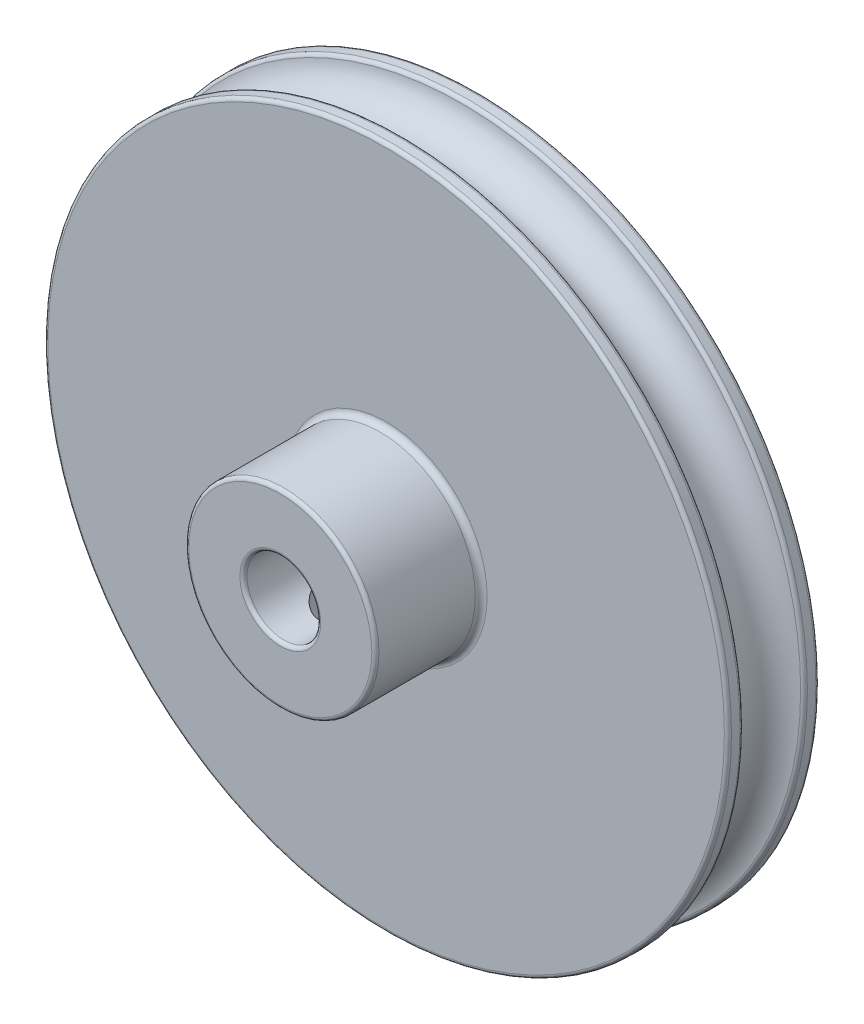
ISO-10303-21;
HEADER;
FILE_DESCRIPTION(('STEP AP214'),'2;1');
FILE_NAME('part.step','',(''),(''),'','','');
FILE_SCHEMA(('AUTOMOTIVE_DESIGN { 1 0 10303 214 1 1 1 1 }'));
ENDSEC;
DATA;
#1=APPLICATION_CONTEXT('core data for automotive mechanical design processes');
#2=APPLICATION_PROTOCOL_DEFINITION('international standard','automotive_design',2000,#1);
#3=PRODUCT_CONTEXT('',#1,'mechanical');
#4=PRODUCT('Part','Part','',(#3));
#5=PRODUCT_RELATED_PRODUCT_CATEGORY('part','',(#4));
#6=PRODUCT_DEFINITION_FORMATION('','',#4);
#7=PRODUCT_DEFINITION_CONTEXT('part definition',#1,'design');
#8=PRODUCT_DEFINITION('design','',#6,#7);
#9=PRODUCT_DEFINITION_SHAPE('','',#8);
#10=(LENGTH_UNIT() NAMED_UNIT(*) SI_UNIT(.MILLI.,.METRE.));
#11=(NAMED_UNIT(*) PLANE_ANGLE_UNIT() SI_UNIT($,.RADIAN.));
#12=(NAMED_UNIT(*) SI_UNIT($,.STERADIAN.) SOLID_ANGLE_UNIT());
#13=UNCERTAINTY_MEASURE_WITH_UNIT(LENGTH_MEASURE(1.E-05),#10,'distance_accuracy_value','');
#14=(GEOMETRIC_REPRESENTATION_CONTEXT(3) GLOBAL_UNCERTAINTY_ASSIGNED_CONTEXT((#13)) GLOBAL_UNIT_ASSIGNED_CONTEXT((#10,
#11,#12)) REPRESENTATION_CONTEXT('',''));
#15=CARTESIAN_POINT('',(0.,0.,0.));
#16=DIRECTION('',(0.,0.,1.));
#17=DIRECTION('',(1.,0.,0.));
#18=AXIS2_PLACEMENT_3D('',#15,#16,#17);
#19=CARTESIAN_POINT('',(0.,0.,3.85));
#20=DIRECTION('',(0.,0.,-1.));
#21=DIRECTION('',(-1.,0.,0.));
#22=AXIS2_PLACEMENT_3D('',#19,#20,#21);
#23=CYLINDRICAL_SURFACE('',#22,28.75);
#24=CARTESIAN_POINT('',(0.,0.,3.55));
#25=DIRECTION('',(0.,0.,1.));
#26=DIRECTION('',(1.,0.,0.));
#27=AXIS2_PLACEMENT_3D('',#24,#25,#26);
#28=CIRCLE('',#27,28.75);
#29=CARTESIAN_POINT('',(28.75,0.,3.55));
#30=VERTEX_POINT('',#29);
#31=EDGE_CURVE('E105',#30,#30,#28,.F.);
#32=ORIENTED_EDGE('',*,*,#31,.T.);
#33=EDGE_LOOP('',(#32));
#34=FACE_BOUND('',#33,.T.);
#35=CARTESIAN_POINT('',(0.,0.,2.83416654415368));
#36=DIRECTION('',(0.,0.,-1.));
#37=DIRECTION('',(-1.,0.,0.));
#38=AXIS2_PLACEMENT_3D('',#35,#36,#37);
#39=CIRCLE('',#38,28.75);
#40=CARTESIAN_POINT('',(28.75,0.,2.83416654415368));
#41=VERTEX_POINT('',#40);
#42=EDGE_CURVE('E79',#41,#41,#39,.F.);
#43=ORIENTED_EDGE('',*,*,#42,.T.);
#44=EDGE_LOOP('',(#43));
#45=FACE_BOUND('',#44,.T.);
#46=ADVANCED_FACE('F49',(#34,#45),#23,.T.);
#47=CARTESIAN_POINT('',(0.,0.,3.85));
#48=DIRECTION('',(0.,0.,1.));
#49=DIRECTION('',(1.,0.,0.));
#50=AXIS2_PLACEMENT_3D('',#47,#48,#49);
#51=PLANE('',#50);
#52=CARTESIAN_POINT('',(0.,0.,3.85));
#53=DIRECTION('',(0.,0.,1.));
#54=DIRECTION('',(1.,0.,0.));
#55=AXIS2_PLACEMENT_3D('',#52,#53,#54);
#56=CIRCLE('',#55,28.45);
#57=CARTESIAN_POINT('',(28.45,0.,3.85));
#58=VERTEX_POINT('',#57);
#59=EDGE_CURVE('E111',#58,#58,#56,.T.);
#60=ORIENTED_EDGE('',*,*,#59,.T.);
#61=EDGE_LOOP('',(#60));
#62=FACE_BOUND('',#61,.T.);
#63=CARTESIAN_POINT('',(0.,0.,3.85));
#64=DIRECTION('',(0.,0.,1.));
#65=DIRECTION('',(1.,0.,0.));
#66=AXIS2_PLACEMENT_3D('',#63,#64,#65);
#67=CIRCLE('',#66,8.5);
#68=CARTESIAN_POINT('',(8.5,0.,3.85));
#69=VERTEX_POINT('',#68);
#70=EDGE_CURVE('E131',#69,#69,#67,.F.);
#71=ORIENTED_EDGE('',*,*,#70,.T.);
#72=EDGE_LOOP('',(#71));
#73=FACE_BOUND('',#72,.T.);
#74=ADVANCED_FACE('F176',(#62,#73),#51,.T.);
#75=CARTESIAN_POINT('',(0.,0.,0.));
#76=DIRECTION('',(0.,0.,1.));
#77=DIRECTION('',(1.,0.,0.));
#78=AXIS2_PLACEMENT_3D('',#75,#76,#77);
#79=TOROIDAL_SURFACE('',#78,28.75,2.55);
#80=CARTESIAN_POINT('',(28.75,0.,0.));
#81=DIRECTION('',(0.,1.,0.));
#82=DIRECTION('',(0.,0.,1.));
#83=AXIS2_PLACEMENT_3D('',#80,#81,#82);
#84=CIRCLE('',#83,2.55);
#85=CARTESIAN_POINT('',(28.4815789473681,0.,-2.53583322371638));
#86=VERTEX_POINT('',#85);
#87=CARTESIAN_POINT('',(28.4815789473681,0.,2.53583322371638));
#88=VERTEX_POINT('',#87);
#89=EDGE_CURVE('E138',#86,#88,#84,.T.);
#90=ORIENTED_EDGE('',*,*,#89,.T.);
#91=CARTESIAN_POINT('',(0.,0.,2.53583322371638));
#92=DIRECTION('',(0.,0.,-1.));
#93=DIRECTION('',(-1.,0.,0.));
#94=AXIS2_PLACEMENT_3D('',#91,#92,#93);
#95=CIRCLE('',#94,28.4815789473684);
#96=EDGE_CURVE('E81',#88,#88,#95,.T.);
#97=ORIENTED_EDGE('',*,*,#96,.T.);
#98=ORIENTED_EDGE('',*,*,#89,.F.);
#99=CARTESIAN_POINT('',(0.,0.,-2.53583322371638));
#100=DIRECTION('',(0.,0.,1.));
#101=DIRECTION('',(1.,0.,0.));
#102=AXIS2_PLACEMENT_3D('',#99,#100,#101);
#103=CIRCLE('',#102,28.4815789473684);
#104=EDGE_CURVE('E101',#86,#86,#103,.T.);
#105=ORIENTED_EDGE('',*,*,#104,.T.);
#106=EDGE_LOOP('',(#90,#97,#98,#105));
#107=FACE_BOUND('',#106,.T.);
#108=ADVANCED_FACE('F172',(#107),#79,.F.);
#109=CARTESIAN_POINT('',(0.,0.,-3.85));
#110=DIRECTION('',(0.,0.,1.));
#111=DIRECTION('',(1.,0.,0.));
#112=AXIS2_PLACEMENT_3D('',#109,#110,#111);
#113=PLANE('',#112);
#114=CARTESIAN_POINT('',(0.,0.,-3.85));
#115=DIRECTION('',(0.,0.,1.));
#116=DIRECTION('',(1.,0.,0.));
#117=AXIS2_PLACEMENT_3D('',#114,#115,#116);
#118=CIRCLE('',#117,28.45);
#119=CARTESIAN_POINT('',(28.45,0.,-3.85));
#120=VERTEX_POINT('',#119);
#121=EDGE_CURVE('E12',#120,#120,#118,.F.);
#122=ORIENTED_EDGE('',*,*,#121,.T.);
#123=EDGE_LOOP('',(#122));
#124=FACE_BOUND('',#123,.T.);
#125=ADVANCED_FACE('F175',(#124),#113,.F.);
#126=CARTESIAN_POINT('',(0.,0.,-2.83416654415368));
#127=DIRECTION('',(0.,0.,1.));
#128=DIRECTION('',(1.,0.,0.));
#129=AXIS2_PLACEMENT_3D('',#126,#127,#128);
#130=CIRCLE('',#129,28.75);
#131=CARTESIAN_POINT('',(28.75,0.,-2.83416654415368));
#132=VERTEX_POINT('',#131);
#133=EDGE_CURVE('E59',#132,#132,#130,.F.);
#134=ORIENTED_EDGE('',*,*,#133,.T.);
#135=EDGE_LOOP('',(#134));
#136=FACE_BOUND('',#135,.T.);
#137=CARTESIAN_POINT('',(0.,0.,-3.55));
#138=DIRECTION('',(0.,0.,1.));
#139=DIRECTION('',(1.,0.,0.));
#140=AXIS2_PLACEMENT_3D('',#137,#138,#139);
#141=CIRCLE('',#140,28.75);
#142=CARTESIAN_POINT('',(28.75,0.,-3.55));
#143=VERTEX_POINT('',#142);
#144=EDGE_CURVE('E95',#143,#143,#141,.T.);
#145=ORIENTED_EDGE('',*,*,#144,.T.);
#146=EDGE_LOOP('',(#145));
#147=FACE_BOUND('',#146,.T.);
#148=ADVANCED_FACE('F170',(#136,#147),#23,.T.);
#149=CARTESIAN_POINT('',(0.,0.,12.75));
#150=DIRECTION('',(0.,0.,-1.));
#151=DIRECTION('',(-1.,0.,0.));
#152=AXIS2_PLACEMENT_3D('',#149,#150,#151);
#153=CYLINDRICAL_SURFACE('',#152,8.);
#154=CARTESIAN_POINT('',(0.,0.,12.45));
#155=DIRECTION('',(0.,0.,1.));
#156=DIRECTION('',(1.,0.,0.));
#157=AXIS2_PLACEMENT_3D('',#154,#155,#156);
#158=CIRCLE('',#157,8.);
#159=CARTESIAN_POINT('',(8.,0.,12.45));
#160=VERTEX_POINT('',#159);
#161=EDGE_CURVE('E115',#160,#160,#158,.F.);
#162=ORIENTED_EDGE('',*,*,#161,.T.);
#163=EDGE_LOOP('',(#162));
#164=FACE_BOUND('',#163,.T.);
#165=CARTESIAN_POINT('',(0.,0.,4.35));
#166=DIRECTION('',(0.,0.,1.));
#167=DIRECTION('',(1.,0.,0.));
#168=AXIS2_PLACEMENT_3D('',#165,#166,#167);
#169=CIRCLE('',#168,8.);
#170=CARTESIAN_POINT('',(8.,0.,4.35));
#171=VERTEX_POINT('',#170);
#172=EDGE_CURVE('E135',#171,#171,#169,.T.);
#173=ORIENTED_EDGE('',*,*,#172,.T.);
#174=EDGE_LOOP('',(#173));
#175=FACE_BOUND('',#174,.T.);
#176=CARTESIAN_POINT('',(0.,-8.,9.5));
#177=CARTESIAN_POINT('',(0.110501451559641,-7.9999981315735,9.49999689901579));
#178=CARTESIAN_POINT('',(0.221037543774351,-7.99768770842435,9.49081126563495));
#179=CARTESIAN_POINT('',(0.438941765027377,-7.98869485106526,9.45436646492399));
#180=CARTESIAN_POINT('',(0.546308062494319,-7.98200993893301,9.42709705394953));
#181=CARTESIAN_POINT('',(0.754694496243435,-7.96500835109376,9.35541432871722));
#182=CARTESIAN_POINT('',(0.855722084573336,-7.95469603789411,9.31102160171297));
#183=CARTESIAN_POINT('',(1.04889617587257,-7.93153791743495,9.20642481327354));
#184=CARTESIAN_POINT('',(1.14104237913168,-7.91869202472209,9.14622021850805));
#185=CARTESIAN_POINT('',(1.31573590306789,-7.89156551455591,9.01039894712776));
#186=CARTESIAN_POINT('',(1.39807425341474,-7.87726276197502,8.93451790005459));
#187=CARTESIAN_POINT('',(1.54899856960443,-7.84898160157248,8.77006372678795));
#188=CARTESIAN_POINT('',(1.61758298259892,-7.83500323053157,8.68148916940408));
#189=CARTESIAN_POINT('',(1.74003539039863,-7.80873034264225,8.49253969768401));
#190=CARTESIAN_POINT('',(1.79366962123352,-7.79646392619748,8.39200902558836));
#191=CARTESIAN_POINT('',(1.88319587806766,-7.77532659757355,8.18300211778662));
#192=CARTESIAN_POINT('',(1.91909074058685,-7.76645514259225,8.07452715555731));
#193=CARTESIAN_POINT('',(1.97140644907302,-7.7533396892843,7.85500866906446));
#194=CARTESIAN_POINT('',(1.98820302444274,-7.74900654662681,7.74406013861601));
#195=CARTESIAN_POINT('',(2.00301570008854,-7.74519149946122,7.52084190800087));
#196=CARTESIAN_POINT('',(2.00103485575748,-7.74570880570571,7.40857242574382));
#197=CARTESIAN_POINT('',(1.97864869951961,-7.75145607355756,7.1887789230062));
#198=CARTESIAN_POINT('',(1.95869112025418,-7.75657150676391,7.08120583804623));
#199=CARTESIAN_POINT('',(1.90163224920399,-7.77075612894758,6.87098526545192));
#200=CARTESIAN_POINT('',(1.86452973609252,-7.77982559958985,6.76833812929477));
#201=CARTESIAN_POINT('',(1.77385263724958,-7.80100151874212,6.56968264499716));
#202=CARTESIAN_POINT('',(1.72011555631056,-7.81313769959755,6.47375177094724));
#203=CARTESIAN_POINT('',(1.59780836801993,-7.83906281127988,6.29210838699091));
#204=CARTESIAN_POINT('',(1.52923566507845,-7.85285203112837,6.20639766924367));
#205=CARTESIAN_POINT('',(1.37688456624163,-7.88101174053188,6.04506184574079));
#206=CARTESIAN_POINT('',(1.29272834422115,-7.89538759304001,5.96979401325153));
#207=CARTESIAN_POINT('',(1.11281589000493,-7.92274620771675,5.8343716767148));
#208=CARTESIAN_POINT('',(1.01705930361059,-7.93572892732543,5.77421763431525));
#209=CARTESIAN_POINT('',(0.816154518241855,-7.9589030945892,5.67059921836749));
#210=CARTESIAN_POINT('',(0.710975190944831,-7.96908480170303,5.62719287966076));
#211=CARTESIAN_POINT('',(0.49450134419051,-7.98543889321888,5.55877692572057));
#212=CARTESIAN_POINT('',(0.383207998867312,-7.99161204452374,5.53376379144248));
#213=CARTESIAN_POINT('',(0.160719960520035,-7.999139990285,5.50338991258822));
#214=CARTESIAN_POINT('',(0.0495956266509452,-8.00061404677705,5.4975426318996));
#215=CARTESIAN_POINT('',(-0.172043833068678,-7.99891739752601,5.50433200274065));
#216=CARTESIAN_POINT('',(-0.282559012859461,-7.99574710989128,5.51696699039884));
#217=CARTESIAN_POINT('',(-0.498152358368656,-7.98519441503143,5.55996121118851));
#218=CARTESIAN_POINT('',(-0.603286825291673,-7.97787512247748,5.59005501796932));
#219=CARTESIAN_POINT('',(-0.807009723270016,-7.95984942178845,5.66680944537126));
#220=CARTESIAN_POINT('',(-0.905597492043513,-7.94914267159856,5.71347173908423));
#221=CARTESIAN_POINT('',(-1.0953641792398,-7.92524410568414,5.82298150516631));
#222=CARTESIAN_POINT('',(-1.18638058911444,-7.91201156489243,5.88610148319569));
#223=CARTESIAN_POINT('',(-1.35670215152433,-7.88459345583226,6.02638654506263));
#224=CARTESIAN_POINT('',(-1.43600527863068,-7.87040772335606,6.10355405282254));
#225=CARTESIAN_POINT('',(-1.58265409076364,-7.84225275947695,6.27200261445929));
#226=CARTESIAN_POINT('',(-1.64965849016271,-7.82829738916375,6.36358360400323));
#227=CARTESIAN_POINT('',(-1.7673476786836,-7.80257171169652,6.55697684595429));
#228=CARTESIAN_POINT('',(-1.81803319221058,-7.79080130756035,6.65878864394634));
#229=CARTESIAN_POINT('',(-1.90126856081239,-7.77090792979553,6.86920762988411));
#230=CARTESIAN_POINT('',(-1.93392586220542,-7.76276340389207,6.97777017112535));
#231=CARTESIAN_POINT('',(-1.98046087993837,-7.75102325453578,7.19907951718548));
#232=CARTESIAN_POINT('',(-1.99434270330488,-7.74742663626581,7.31182540137666));
#233=CARTESIAN_POINT('',(-2.00271812044533,-7.74526534938609,7.53482803180694));
#234=CARTESIAN_POINT('',(-1.99775719704016,-7.74655910304352,7.64506324683298));
#235=CARTESIAN_POINT('',(-1.96983637108382,-7.7537054534379,7.86307185155731));
#236=CARTESIAN_POINT('',(-1.94687683024903,-7.75955795855809,7.97084529068487));
#237=CARTESIAN_POINT('',(-1.88390842592373,-7.77508347576963,8.18027794542055));
#238=CARTESIAN_POINT('',(-1.84400187290717,-7.78473353648412,8.28196974032028));
#239=CARTESIAN_POINT('',(-1.74835321814009,-7.80677007633105,8.47728717695159));
#240=CARTESIAN_POINT('',(-1.69260892004558,-7.81915693494364,8.57091169758256));
#241=CARTESIAN_POINT('',(-1.56515699818285,-7.8456751235135,8.75007283866936));
#242=CARTESIAN_POINT('',(-1.493070883883,-7.85984353109009,8.83533476456528));
#243=CARTESIAN_POINT('',(-1.33571916158631,-7.88810702995048,8.99272939306054));
#244=CARTESIAN_POINT('',(-1.25045042834819,-7.90220210302746,9.06485897348396));
#245=CARTESIAN_POINT('',(-1.06729011560345,-7.92903540863551,9.19521507808614));
#246=CARTESIAN_POINT('',(-0.969197896421848,-7.94174444487824,9.25316615156211));
#247=CARTESIAN_POINT('',(-0.764354746013967,-7.96406566633491,9.35166328392071));
#248=CARTESIAN_POINT('',(-0.657610084582319,-7.97368006933042,9.39222181419805));
#249=CARTESIAN_POINT('',(-0.459213670991295,-7.98730746087389,9.44876244043954));
#250=CARTESIAN_POINT('',(-0.368506894544092,-7.9920344673692,9.46793499073791));
#251=CARTESIAN_POINT('',(-0.185208095381711,-7.99838140309264,9.49355459149592));
#252=CARTESIAN_POINT('',(-0.0926162149901552,-8.00000156601192,9.50000259907373));
#253=CARTESIAN_POINT('',(0.,-8.,9.5));
#254=B_SPLINE_CURVE_WITH_KNOTS('',3,(#176,#177,#178,#179,#180,#181,#182,#183,#184,#185,#186,
#187,#188,#189,#190,#191,#192,#193,#194,#195,#196,#197,#198,#199,#200,#201,#202,#203,#204,#205,
#206,#207,#208,#209,#210,#211,#212,#213,#214,#215,#216,#217,#218,#219,#220,#221,#222,#223,#224,
#225,#226,#227,#228,#229,#230,#231,#232,#233,#234,#235,#236,#237,#238,#239,#240,#241,#242,#243,
#244,#245,#246,#247,#248,#249,#250,#251,#252,#253),.UNSPECIFIED.,.T.,.F.,(4,2,2,2,2,2,2,2,2,2,2,
2,2,2,2,2,2,2,2,2,2,2,2,2,2,2,2,2,2,2,2,2,2,2,2,2,2,2,4),(0.,0.331164949962519,
0.662517650351866,0.993473203048141,1.32443992022577,1.66152580582852,1.99864972773416,
2.34078196727742,2.68285948225824,3.01808393468093,3.3532538415469,3.68029996013785,
4.00736937959146,4.337740371696,4.66816921119311,5.00802001296453,5.34788119415424,
5.6889097201658,6.02987298255951,6.36211078603463,6.69431868154752,7.02160366023144,
7.34892169767482,7.68204783424897,8.01523150681786,8.35659345610396,8.69794025003772,
9.03723006156476,9.37644564340971,9.70591707202578,10.0353818794581,10.3628853408369,
10.6904342418696,11.0265276855097,11.3627009303165,11.7049624733721,12.0469781843289,
12.3245632392729,12.6021274139515),.UNSPECIFIED.);
#255=CARTESIAN_POINT('',(0.,-8.,9.5));
#256=VERTEX_POINT('',#255);
#257=EDGE_CURVE('E89',#256,#256,#254,.T.);
#258=ORIENTED_EDGE('',*,*,#257,.T.);
#259=EDGE_LOOP('',(#258));
#260=FACE_BOUND('',#259,.T.);
#261=ADVANCED_FACE('F165',(#164,#175,#260),#153,.T.);
#262=CARTESIAN_POINT('',(0.,0.,12.75));
#263=DIRECTION('',(0.,0.,1.));
#264=DIRECTION('',(1.,0.,0.));
#265=AXIS2_PLACEMENT_3D('',#262,#263,#264);
#266=PLANE('',#265);
#267=CARTESIAN_POINT('',(0.,0.,12.75));
#268=DIRECTION('',(0.,0.,1.));
#269=DIRECTION('',(1.,0.,0.));
#270=AXIS2_PLACEMENT_3D('',#267,#268,#269);
#271=CIRCLE('',#270,3.4);
#272=CARTESIAN_POINT('',(3.4,0.,12.75));
#273=VERTEX_POINT('',#272);
#274=EDGE_CURVE('E119',#273,#273,#271,.F.);
#275=ORIENTED_EDGE('',*,*,#274,.T.);
#276=EDGE_LOOP('',(#275));
#277=FACE_BOUND('',#276,.T.);
#278=CARTESIAN_POINT('',(0.,0.,12.75));
#279=DIRECTION('',(0.,0.,1.));
#280=DIRECTION('',(1.,0.,0.));
#281=AXIS2_PLACEMENT_3D('',#278,#279,#280);
#282=CIRCLE('',#281,7.7);
#283=CARTESIAN_POINT('',(7.7,0.,12.75));
#284=VERTEX_POINT('',#283);
#285=EDGE_CURVE('E123',#284,#284,#282,.T.);
#286=ORIENTED_EDGE('',*,*,#285,.T.);
#287=EDGE_LOOP('',(#286));
#288=FACE_BOUND('',#287,.T.);
#289=ADVANCED_FACE('F169',(#277,#288),#266,.T.);
#290=CARTESIAN_POINT('',(0.,0.,-12.6181240867132));
#291=DIRECTION('',(0.,0.,1.));
#292=DIRECTION('',(1.,0.,0.));
#293=AXIS2_PLACEMENT_3D('',#290,#291,#292);
#294=CYLINDRICAL_SURFACE('',#293,3.1);
#295=CARTESIAN_POINT('',(0.,0.,12.45));
#296=DIRECTION('',(0.,0.,1.));
#297=DIRECTION('',(1.,0.,0.));
#298=AXIS2_PLACEMENT_3D('',#295,#296,#297);
#299=CIRCLE('',#298,3.1);
#300=CARTESIAN_POINT('',(3.1,0.,12.45));
#301=VERTEX_POINT('',#300);
#302=EDGE_CURVE('E127',#301,#301,#299,.T.);
#303=ORIENTED_EDGE('',*,*,#302,.T.);
#304=EDGE_LOOP('',(#303));
#305=FACE_BOUND('',#304,.T.);
#306=CARTESIAN_POINT('',(0.,-3.1,9.5));
#307=CARTESIAN_POINT('',(-0.101091385039777,-3.09999460939274,9.49999423985456));
#308=CARTESIAN_POINT('',(-0.202236134564494,-3.09500777365122,9.49228861003426));
#309=CARTESIAN_POINT('',(-0.40134422219677,-3.07554251080367,9.46191052513201));
#310=CARTESIAN_POINT('',(-0.499304337672782,-3.0610547651011,9.43922337585951));
#311=CARTESIAN_POINT('',(-0.688847609969658,-3.02403316266577,9.38023929755381));
#312=CARTESIAN_POINT('',(-0.780458562332545,-3.00153742435718,9.34400680467486));
#313=CARTESIAN_POINT('',(-0.955964244967446,-2.95033924070804,9.25944096599089));
#314=CARTESIAN_POINT('',(-1.03985843062382,-2.9216363577727,9.21110676699504));
#315=CARTESIAN_POINT('',(-1.20534975085783,-2.85755815418126,9.09934687867213));
#316=CARTESIAN_POINT('',(-1.28618869122808,-2.82182799524603,9.0350061395549));
#317=CARTESIAN_POINT('',(-1.43665631544782,-2.74828108070154,8.89520120954714));
#318=CARTESIAN_POINT('',(-1.50626924383573,-2.71046149080006,8.81972166508535));
#319=CARTESIAN_POINT('',(-1.64268679943019,-2.63034253686168,8.64691651791072));
#320=CARTESIAN_POINT('',(-1.70759476074744,-2.58819607847858,8.54801033709484));
#321=CARTESIAN_POINT('',(-1.81972592440112,-2.51062817225813,8.33825819113032));
#322=CARTESIAN_POINT('',(-1.86697956402236,-2.47519520238284,8.2274332037925));
#323=CARTESIAN_POINT('',(-1.93115046035712,-2.42525032881529,8.02768249145855));
#324=CARTESIAN_POINT('',(-1.95283049983355,-2.40766682164749,7.94106125555081));
#325=CARTESIAN_POINT('',(-1.98446592184547,-2.38166474413427,7.76441515405156));
#326=CARTESIAN_POINT('',(-1.99443957013961,-2.37323189735386,7.67439581776609));
#327=CARTESIAN_POINT('',(-2.00204983941226,-2.36681793758445,7.49315258210891));
#328=CARTESIAN_POINT('',(-1.99964615392167,-2.36887097141953,7.4019257134594));
#329=CARTESIAN_POINT('',(-1.98258006769263,-2.38316799120796,7.2214121827045));
#330=CARTESIAN_POINT('',(-1.96790747526994,-2.39542044970509,7.13212719699272));
#331=CARTESIAN_POINT('',(-1.92786567346179,-2.42774793365928,6.9607019055138));
#332=CARTESIAN_POINT('',(-1.9028579256027,-2.44755702424853,6.87842389978763));
#333=CARTESIAN_POINT('',(-1.84321796757953,-2.49277853296268,6.71910848586362));
#334=CARTESIAN_POINT('',(-1.80858257660194,-2.51819280237145,6.64207282013664));
#335=CARTESIAN_POINT('',(-1.72290696910724,-2.5777531470504,6.47940367147485));
#336=CARTESIAN_POINT('',(-1.66998346799092,-2.61263498659573,6.39503299514242));
#337=CARTESIAN_POINT('',(-1.55262072653794,-2.68404531595956,6.2354053931168));
#338=CARTESIAN_POINT('',(-1.48816769918918,-2.72057573761244,6.16015956168707));
#339=CARTESIAN_POINT('',(-1.33531850150805,-2.79921977867378,6.00641965469216));
#340=CARTESIAN_POINT('',(-1.2446991971314,-2.84108811643832,5.92998603795691));
#341=CARTESIAN_POINT('',(-1.04963410942446,-2.91877600894092,5.79342507092218));
#342=CARTESIAN_POINT('',(-0.945202988602563,-2.95460188779143,5.73328063171092));
#343=CARTESIAN_POINT('',(-0.746639365899209,-3.01014273026213,5.64204748666379));
#344=CARTESIAN_POINT('',(-0.65456737995395,-3.03164347825907,5.6075627187463));
#345=CARTESIAN_POINT('',(-0.464930213104867,-3.06644845105128,5.55229077747468));
#346=CARTESIAN_POINT('',(-0.367369568656605,-3.07975933933833,5.53149246748689));
#347=CARTESIAN_POINT('',(-0.169045410576032,-3.0969921575555,5.50463832866688));
#348=CARTESIAN_POINT('',(-0.0682718516736113,-3.10088094883133,5.49863453267088));
#349=CARTESIAN_POINT('',(0.132930127327373,-3.0987818893615,5.50188808806102));
#350=CARTESIAN_POINT('',(0.233358534619953,-3.09279367603535,5.51114599969775));
#351=CARTESIAN_POINT('',(0.425119290519885,-3.0721423509695,5.54342154508947));
#352=CARTESIAN_POINT('',(0.51664537144639,-3.05798682310753,5.56563483512585));
#353=CARTESIAN_POINT('',(0.694421792387248,-3.02258192723568,5.62210647387215));
#354=CARTESIAN_POINT('',(0.780671246170739,-3.00133137143629,5.65636683945258));
#355=CARTESIAN_POINT('',(0.952313130749649,-2.95155061853353,5.73852436888356));
#356=CARTESIAN_POINT('',(1.03719832856589,-2.92260695610669,5.78722473299525));
#357=CARTESIAN_POINT('',(1.19797699917457,-2.86047105425269,5.89554882406114));
#358=CARTESIAN_POINT('',(1.27386369806246,-2.82727565280704,5.95518069515739));
#359=CARTESIAN_POINT('',(1.42679573254823,-2.75363680286679,6.09411453626771));
#360=CARTESIAN_POINT('',(1.502217991591,-2.71286465557268,6.17503157595802));
#361=CARTESIAN_POINT('',(1.63901758369639,-2.63247341235496,6.34855184705935));
#362=CARTESIAN_POINT('',(1.70039095540679,-2.59285464439052,6.44115836314992));
#363=CARTESIAN_POINT('',(1.80081056775826,-2.5239466231388,6.62446981638804));
#364=CARTESIAN_POINT('',(1.84170928019883,-2.49398430191481,6.71390042775378));
#365=CARTESIAN_POINT('',(1.91037132253394,-2.44179234650511,6.8997766615712));
#366=CARTESIAN_POINT('',(1.93815244113827,-2.41955225114483,6.99621257806556));
#367=CARTESIAN_POINT('',(1.97925302886152,-2.38606269457456,7.19512500607156));
#368=CARTESIAN_POINT('',(1.99242553477726,-2.37492503520893,7.29765216173333));
#369=CARTESIAN_POINT('',(2.00265608987801,-2.36631138405995,7.50404792910151));
#370=CARTESIAN_POINT('',(1.99972843393145,-2.36882327321338,7.60791526916267));
#371=CARTESIAN_POINT('',(1.97974948336216,-2.385519162785,7.79704235785586));
#372=CARTESIAN_POINT('',(1.96492208911016,-2.39786312632663,7.88272249216542));
#373=CARTESIAN_POINT('',(1.92478575684782,-2.43019785844483,8.05010808712704));
#374=CARTESIAN_POINT('',(1.8994662269818,-2.45019635274102,8.13180943777216));
#375=CARTESIAN_POINT('',(1.8289643349275,-2.50348562062322,8.31720982840996));
#376=CARTESIAN_POINT('',(1.77994565236697,-2.53898245001553,8.41881180681012));
#377=CARTESIAN_POINT('',(1.66665742988777,-2.61474699558477,8.61119491391551));
#378=CARTESIAN_POINT('',(1.60236450988041,-2.65502197783671,8.70195913016394));
#379=CARTESIAN_POINT('',(1.45888519845899,-2.73652246794838,8.87267718655171));
#380=CARTESIAN_POINT('',(1.37951440481604,-2.77775351345464,8.95247350407429));
#381=CARTESIAN_POINT('',(1.20753038667599,-2.85671179204102,9.09829677390185));
#382=CARTESIAN_POINT('',(1.11492957876487,-2.89444225631806,9.16433649573719));
#383=CARTESIAN_POINT('',(0.930076713789365,-2.95860078482454,9.27341698597728));
#384=CARTESIAN_POINT('',(0.839194900302701,-2.98584930398292,9.318291150779));
#385=CARTESIAN_POINT('',(0.650002847052295,-3.03264637260129,9.39415954682018));
#386=CARTESIAN_POINT('',(0.551704291854859,-3.05220674429459,9.42517509888306));
#387=CARTESIAN_POINT('',(0.377584832422472,-3.07781554283967,9.46548062779998));
#388=CARTESIAN_POINT('',(0.30291009649643,-3.08609090810034,9.47838335273191));
#389=CARTESIAN_POINT('',(0.15216703635602,-3.09718531112089,9.49564543467788));
#390=CARTESIAN_POINT('',(0.0760986380390963,-3.10000405789149,9.50000433606902));
#391=CARTESIAN_POINT('',(0.,-3.1,9.5));
#392=B_SPLINE_CURVE_WITH_KNOTS('',3,(#306,#307,#308,#309,#310,#311,#312,#313,#314,#315,#316,
#317,#318,#319,#320,#321,#322,#323,#324,#325,#326,#327,#328,#329,#330,#331,#332,#333,#334,#335,
#336,#337,#338,#339,#340,#341,#342,#343,#344,#345,#346,#347,#348,#349,#350,#351,#352,#353,#354,
#355,#356,#357,#358,#359,#360,#361,#362,#363,#364,#365,#366,#367,#368,#369,#370,#371,#372,#373,
#374,#375,#376,#377,#378,#379,#380,#381,#382,#383,#384,#385,#386,#387,#388,#389,#390,#391),
.UNSPECIFIED.,.T.,.F.,(4,2,2,2,2,2,2,2,2,2,2,2,2,2,2,2,2,2,2,2,2,2,2,2,2,2,2,2,2,2,2,2,2,2,2,2,
2,2,2,2,2,2,4),(0.,0.302966311138187,0.606230220275506,0.908069468488516,1.20993000287647,
1.53665065809857,1.86382594121082,2.23880818267474,2.61314091205647,2.88505518621458,
3.15654461969954,3.42891870954099,3.70151928342565,3.96529957222992,4.22916711345738,
4.54461288083483,4.86043841114649,5.23578572642889,5.61073772744286,5.91138256881843,
6.21178247281048,6.51323739565213,6.814703385018,7.09919018653744,7.38372463832978,
7.68871147259943,7.99392645710977,8.34616896663427,8.69851067565524,9.00574516973998,
9.31256181935081,9.62243782101927,9.9320387371862,10.1943851218243,10.4569969939451,
10.8099170659531,11.1633808690887,11.521483908107,11.8792530427354,12.1928227029758,
12.5059082759399,12.7339602929413,12.9620244711131),.UNSPECIFIED.);
#393=CARTESIAN_POINT('',(0.,-3.1,9.5));
#394=VERTEX_POINT('',#393);
#395=EDGE_CURVE('E83',#394,#394,#392,.T.);
#396=ORIENTED_EDGE('',*,*,#395,.T.);
#397=EDGE_LOOP('',(#396));
#398=FACE_BOUND('',#397,.T.);
#399=CARTESIAN_POINT('',(0.,0.,-2.85));
#400=DIRECTION('',(0.,0.,1.));
#401=DIRECTION('',(1.,0.,0.));
#402=AXIS2_PLACEMENT_3D('',#399,#400,#401);
#403=CIRCLE('',#402,3.1);
#404=CARTESIAN_POINT('',(3.1,0.,-2.85));
#405=VERTEX_POINT('',#404);
#406=EDGE_CURVE('E164',#405,#405,#403,.F.);
#407=ORIENTED_EDGE('',*,*,#406,.T.);
#408=EDGE_LOOP('',(#407));
#409=FACE_BOUND('',#408,.T.);
#410=ADVANCED_FACE('F146',(#305,#398,#409),#294,.F.);
#411=CARTESIAN_POINT('',(0.,0.,-2.85));
#412=DIRECTION('',(0.,0.,1.));
#413=DIRECTION('',(1.,0.,0.));
#414=AXIS2_PLACEMENT_3D('',#411,#412,#413);
#415=PLANE('',#414);
#416=ORIENTED_EDGE('',*,*,#406,.F.);
#417=EDGE_LOOP('',(#416));
#418=FACE_BOUND('',#417,.T.);
#419=ADVANCED_FACE('F154',(#418),#415,.T.);
#420=CARTESIAN_POINT('',(0.,-28.75,7.5));
#421=DIRECTION('',(0.,1.,0.));
#422=DIRECTION('',(0.,0.,1.));
#423=AXIS2_PLACEMENT_3D('',#420,#421,#422);
#424=CYLINDRICAL_SURFACE('',#423,2.);
#425=ORIENTED_EDGE('',*,*,#395,.F.);
#426=EDGE_LOOP('',(#425));
#427=FACE_BOUND('',#426,.T.);
#428=ORIENTED_EDGE('',*,*,#257,.F.);
#429=EDGE_LOOP('',(#428));
#430=FACE_BOUND('',#429,.T.);
#431=ADVANCED_FACE('F150',(#427,#430),#424,.F.);
#432=CARTESIAN_POINT('',(0.,0.,4.35));
#433=DIRECTION('',(0.,0.,1.));
#434=DIRECTION('',(1.,0.,0.));
#435=AXIS2_PLACEMENT_3D('',#432,#433,#434);
#436=TOROIDAL_SURFACE('',#435,8.5,0.5);
#437=ORIENTED_EDGE('',*,*,#70,.F.);
#438=EDGE_LOOP('',(#437));
#439=FACE_BOUND('',#438,.T.);
#440=ORIENTED_EDGE('',*,*,#172,.F.);
#441=EDGE_LOOP('',(#440));
#442=FACE_BOUND('',#441,.T.);
#443=ADVANCED_FACE('F153',(#439,#442),#436,.F.);
#444=CARTESIAN_POINT('',(0.,0.,12.45));
#445=DIRECTION('',(0.,0.,1.));
#446=DIRECTION('',(1.,0.,0.));
#447=AXIS2_PLACEMENT_3D('',#444,#445,#446);
#448=TOROIDAL_SURFACE('',#447,3.4,0.3);
#449=ORIENTED_EDGE('',*,*,#274,.F.);
#450=EDGE_LOOP('',(#449));
#451=FACE_BOUND('',#450,.T.);
#452=ORIENTED_EDGE('',*,*,#302,.F.);
#453=EDGE_LOOP('',(#452));
#454=FACE_BOUND('',#453,.T.);
#455=ADVANCED_FACE('F189',(#451,#454),#448,.T.);
#456=CARTESIAN_POINT('',(0.,0.,12.45));
#457=DIRECTION('',(0.,0.,1.));
#458=DIRECTION('',(1.,0.,0.));
#459=AXIS2_PLACEMENT_3D('',#456,#457,#458);
#460=TOROIDAL_SURFACE('',#459,7.7,0.3);
#461=ORIENTED_EDGE('',*,*,#161,.F.);
#462=EDGE_LOOP('',(#461));
#463=FACE_BOUND('',#462,.T.);
#464=ORIENTED_EDGE('',*,*,#285,.F.);
#465=EDGE_LOOP('',(#464));
#466=FACE_BOUND('',#465,.T.);
#467=ADVANCED_FACE('F193',(#463,#466),#460,.T.);
#468=CARTESIAN_POINT('',(0.,0.,3.55));
#469=DIRECTION('',(0.,0.,1.));
#470=DIRECTION('',(1.,0.,0.));
#471=AXIS2_PLACEMENT_3D('',#468,#469,#470);
#472=TOROIDAL_SURFACE('',#471,28.45,0.3);
#473=ORIENTED_EDGE('',*,*,#31,.F.);
#474=EDGE_LOOP('',(#473));
#475=FACE_BOUND('',#474,.T.);
#476=ORIENTED_EDGE('',*,*,#59,.F.);
#477=EDGE_LOOP('',(#476));
#478=FACE_BOUND('',#477,.T.);
#479=ADVANCED_FACE('F197',(#475,#478),#472,.T.);
#480=CARTESIAN_POINT('',(0.,0.,2.83416654415368));
#481=DIRECTION('',(0.,0.,-1.));
#482=DIRECTION('',(-1.,0.,0.));
#483=AXIS2_PLACEMENT_3D('',#480,#481,#482);
#484=TOROIDAL_SURFACE('',#483,28.45,0.3);
#485=CARTESIAN_POINT('',(28.45,0.,2.83416654415368));
#486=DIRECTION('',(0.,-1.,0.));
#487=DIRECTION('',(0.,0.,-1.));
#488=AXIS2_PLACEMENT_3D('',#485,#486,#487);
#489=CIRCLE('',#488,0.3);
#490=EDGE_CURVE('E73',#88,#41,#489,.T.);
#491=ORIENTED_EDGE('',*,*,#490,.F.);
#492=ORIENTED_EDGE('',*,*,#96,.F.);
#493=ORIENTED_EDGE('',*,*,#490,.T.);
#494=ORIENTED_EDGE('',*,*,#42,.F.);
#495=EDGE_LOOP('',(#491,#492,#493,#494));
#496=FACE_BOUND('',#495,.T.);
#497=ADVANCED_FACE('F77',(#496),#484,.T.);
#498=CARTESIAN_POINT('',(0.,0.,-2.83416654415368));
#499=DIRECTION('',(0.,0.,1.));
#500=DIRECTION('',(1.,0.,0.));
#501=AXIS2_PLACEMENT_3D('',#498,#499,#500);
#502=TOROIDAL_SURFACE('',#501,28.45,0.3);
#503=CARTESIAN_POINT('',(28.45,0.,-2.83416654415368));
#504=DIRECTION('',(0.,1.,0.));
#505=DIRECTION('',(0.,0.,1.));
#506=AXIS2_PLACEMENT_3D('',#503,#504,#505);
#507=CIRCLE('',#506,0.3);
#508=EDGE_CURVE('E53',#86,#132,#507,.T.);
#509=ORIENTED_EDGE('',*,*,#508,.F.);
#510=ORIENTED_EDGE('',*,*,#104,.F.);
#511=ORIENTED_EDGE('',*,*,#508,.T.);
#512=ORIENTED_EDGE('',*,*,#133,.F.);
#513=EDGE_LOOP('',(#509,#510,#511,#512));
#514=FACE_BOUND('',#513,.T.);
#515=ADVANCED_FACE('F203',(#514),#502,.T.);
#516=CARTESIAN_POINT('',(0.,0.,-3.55));
#517=DIRECTION('',(0.,0.,1.));
#518=DIRECTION('',(1.,0.,0.));
#519=AXIS2_PLACEMENT_3D('',#516,#517,#518);
#520=TOROIDAL_SURFACE('',#519,28.45,0.3);
#521=ORIENTED_EDGE('',*,*,#121,.F.);
#522=EDGE_LOOP('',(#521));
#523=FACE_BOUND('',#522,.T.);
#524=ORIENTED_EDGE('',*,*,#144,.F.);
#525=EDGE_LOOP('',(#524));
#526=FACE_BOUND('',#525,.T.);
#527=ADVANCED_FACE('F51',(#523,#526),#520,.T.);
#528=CLOSED_SHELL('',(#46,#74,#108,#125,#148,#261,#289,#410,#419,#431,#443,#455,#467,#479,#497,
#515,#527));
#529=MANIFOLD_SOLID_BREP('B2',#528);
#530=ADVANCED_BREP_SHAPE_REPRESENTATION('',(#18,#529),#14);
#531=SHAPE_DEFINITION_REPRESENTATION(#9,#530);
ENDSEC;
END-ISO-10303-21;
